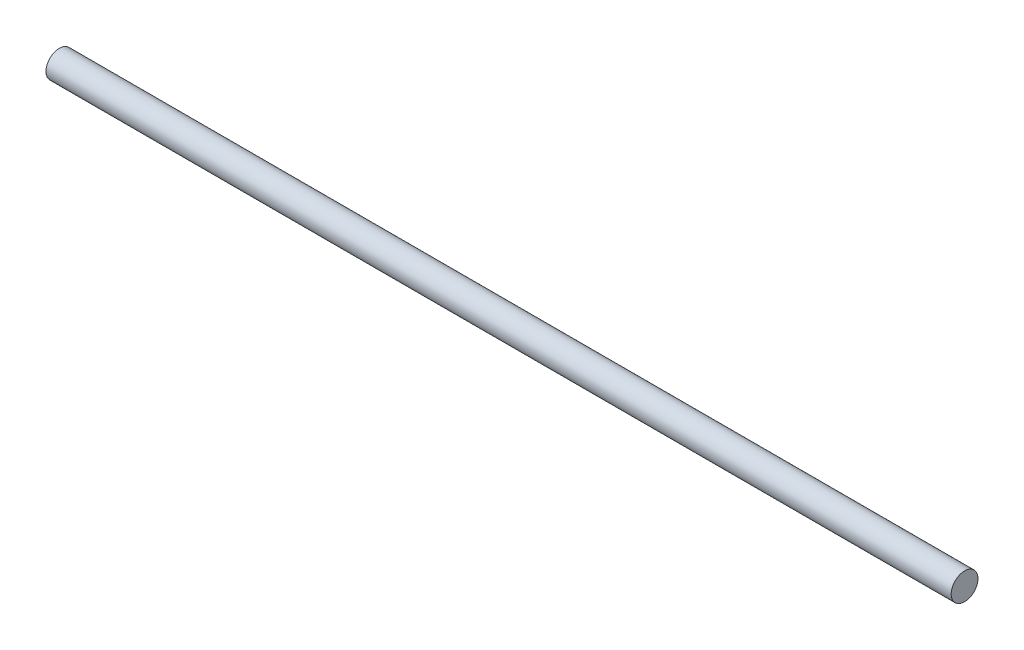
ISO-10303-21;
HEADER;
FILE_DESCRIPTION(('STEP AP214'),'2;1');
FILE_NAME('part.step','',(''),(''),'','','');
FILE_SCHEMA(('AUTOMOTIVE_DESIGN { 1 0 10303 214 1 1 1 1 }'));
ENDSEC;
DATA;
#1=APPLICATION_CONTEXT('core data for automotive mechanical design processes');
#2=APPLICATION_PROTOCOL_DEFINITION('international standard','automotive_design',2000,#1);
#3=PRODUCT_CONTEXT('',#1,'mechanical');
#4=PRODUCT('Part','Part','',(#3));
#5=PRODUCT_RELATED_PRODUCT_CATEGORY('part','',(#4));
#6=PRODUCT_DEFINITION_FORMATION('','',#4);
#7=PRODUCT_DEFINITION_CONTEXT('part definition',#1,'design');
#8=PRODUCT_DEFINITION('design','',#6,#7);
#9=PRODUCT_DEFINITION_SHAPE('','',#8);
#10=(LENGTH_UNIT() NAMED_UNIT(*) SI_UNIT(.MILLI.,.METRE.));
#11=(NAMED_UNIT(*) PLANE_ANGLE_UNIT() SI_UNIT($,.RADIAN.));
#12=(NAMED_UNIT(*) SI_UNIT($,.STERADIAN.) SOLID_ANGLE_UNIT());
#13=UNCERTAINTY_MEASURE_WITH_UNIT(LENGTH_MEASURE(1.E-05),#10,'distance_accuracy_value','');
#14=(GEOMETRIC_REPRESENTATION_CONTEXT(3) GLOBAL_UNCERTAINTY_ASSIGNED_CONTEXT((#13)) GLOBAL_UNIT_ASSIGNED_CONTEXT((#10,
#11,#12)) REPRESENTATION_CONTEXT('',''));
#15=CARTESIAN_POINT('',(0.,0.,0.));
#16=DIRECTION('',(0.,0.,1.));
#17=DIRECTION('',(1.,0.,0.));
#18=AXIS2_PLACEMENT_3D('',#15,#16,#17);
#19=CARTESIAN_POINT('',(270.,0.,0.));
#20=DIRECTION('',(-1.,0.,0.));
#21=DIRECTION('',(0.,0.,1.));
#22=AXIS2_PLACEMENT_3D('',#19,#20,#21);
#23=CYLINDRICAL_SURFACE('',#22,4.);
#24=CARTESIAN_POINT('',(270.,0.,0.));
#25=DIRECTION('',(1.,0.,0.));
#26=DIRECTION('',(0.,0.,-1.));
#27=AXIS2_PLACEMENT_3D('',#24,#25,#26);
#28=CIRCLE('',#27,4.);
#29=CARTESIAN_POINT('',(270.,0.,-4.));
#30=VERTEX_POINT('',#29);
#31=EDGE_CURVE('E10',#30,#30,#28,.T.);
#32=ORIENTED_EDGE('',*,*,#31,.F.);
#33=EDGE_LOOP('',(#32));
#34=FACE_BOUND('',#33,.T.);
#35=CARTESIAN_POINT('',(0.,0.,0.));
#36=DIRECTION('',(1.,0.,0.));
#37=DIRECTION('',(0.,0.,-1.));
#38=AXIS2_PLACEMENT_3D('',#35,#36,#37);
#39=CIRCLE('',#38,4.);
#40=CARTESIAN_POINT('',(0.,0.,-4.));
#41=VERTEX_POINT('',#40);
#42=EDGE_CURVE('E38',#41,#41,#39,.T.);
#43=ORIENTED_EDGE('',*,*,#42,.T.);
#44=EDGE_LOOP('',(#43));
#45=FACE_BOUND('',#44,.T.);
#46=ADVANCED_FACE('F35',(#34,#45),#23,.T.);
#47=CARTESIAN_POINT('',(270.,0.,0.));
#48=DIRECTION('',(1.,0.,0.));
#49=DIRECTION('',(0.,0.,-1.));
#50=AXIS2_PLACEMENT_3D('',#47,#48,#49);
#51=PLANE('',#50);
#52=ORIENTED_EDGE('',*,*,#31,.T.);
#53=EDGE_LOOP('',(#52));
#54=FACE_BOUND('',#53,.T.);
#55=ADVANCED_FACE('F50',(#54),#51,.T.);
#56=CARTESIAN_POINT('',(0.,0.,0.));
#57=DIRECTION('',(1.,0.,0.));
#58=DIRECTION('',(0.,0.,-1.));
#59=AXIS2_PLACEMENT_3D('',#56,#57,#58);
#60=PLANE('',#59);
#61=ORIENTED_EDGE('',*,*,#42,.F.);
#62=EDGE_LOOP('',(#61));
#63=FACE_BOUND('',#62,.T.);
#64=ADVANCED_FACE('F48',(#63),#60,.F.);
#65=CLOSED_SHELL('',(#46,#55,#64));
#66=MANIFOLD_SOLID_BREP('B2',#65);
#67=ADVANCED_BREP_SHAPE_REPRESENTATION('',(#18,#66),#14);
#68=SHAPE_DEFINITION_REPRESENTATION(#9,#67);
ENDSEC;
END-ISO-10303-21;
